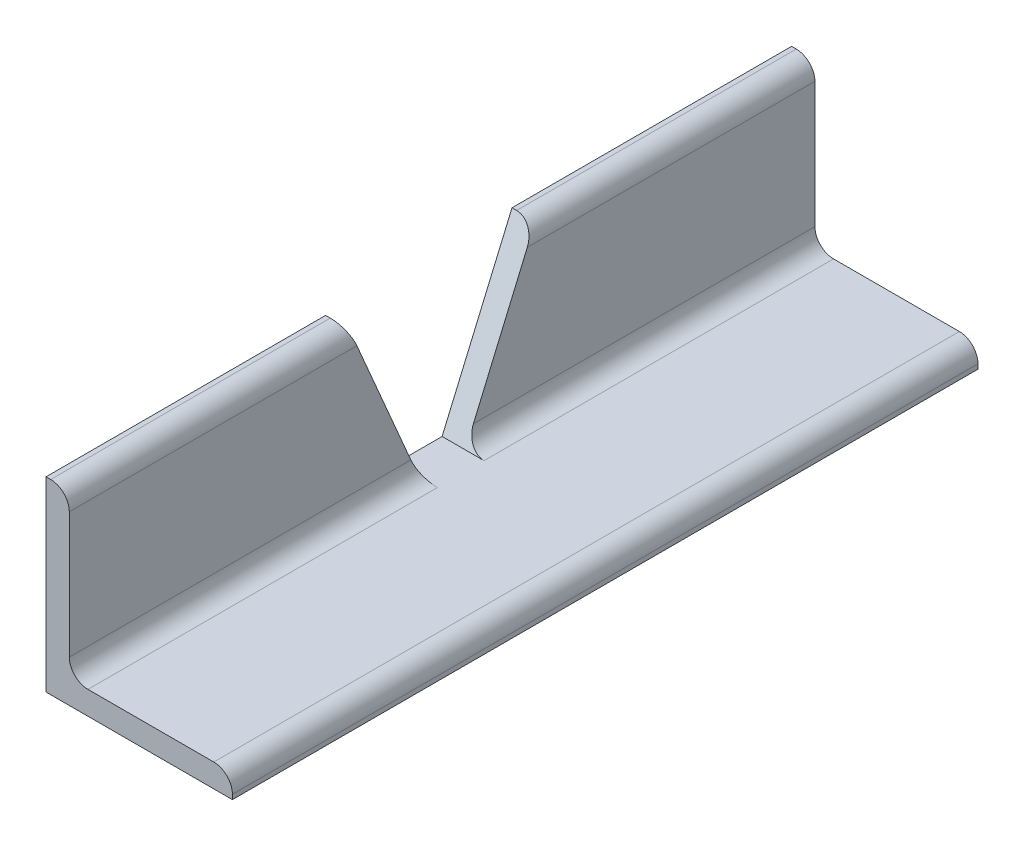
ISO-10303-21;
HEADER;
FILE_DESCRIPTION(('STEP AP214'),'2;1');
FILE_NAME('part.step','',(''),(''),'','','');
FILE_SCHEMA(('AUTOMOTIVE_DESIGN { 1 0 10303 214 1 1 1 1 }'));
ENDSEC;
DATA;
#1=APPLICATION_CONTEXT('core data for automotive mechanical design processes');
#2=APPLICATION_PROTOCOL_DEFINITION('international standard','automotive_design',2000,#1);
#3=PRODUCT_CONTEXT('',#1,'mechanical');
#4=PRODUCT('Part','Part','',(#3));
#5=PRODUCT_RELATED_PRODUCT_CATEGORY('part','',(#4));
#6=PRODUCT_DEFINITION_FORMATION('','',#4);
#7=PRODUCT_DEFINITION_CONTEXT('part definition',#1,'design');
#8=PRODUCT_DEFINITION('design','',#6,#7);
#9=PRODUCT_DEFINITION_SHAPE('','',#8);
#10=(LENGTH_UNIT() NAMED_UNIT(*) SI_UNIT(.MILLI.,.METRE.));
#11=(NAMED_UNIT(*) PLANE_ANGLE_UNIT() SI_UNIT($,.RADIAN.));
#12=(NAMED_UNIT(*) SI_UNIT($,.STERADIAN.) SOLID_ANGLE_UNIT());
#13=UNCERTAINTY_MEASURE_WITH_UNIT(LENGTH_MEASURE(1.E-05),#10,'distance_accuracy_value','');
#14=(GEOMETRIC_REPRESENTATION_CONTEXT(3) GLOBAL_UNCERTAINTY_ASSIGNED_CONTEXT((#13)) GLOBAL_UNIT_ASSIGNED_CONTEXT((#10,
#11,#12)) REPRESENTATION_CONTEXT('',''));
#15=CARTESIAN_POINT('',(0.,0.,0.));
#16=DIRECTION('',(0.,0.,1.));
#17=DIRECTION('',(1.,0.,0.));
#18=AXIS2_PLACEMENT_3D('',#15,#16,#17);
#19=CARTESIAN_POINT('',(-12.065,12.7,50.8));
#20=DIRECTION('',(0.,-1.,0.));
#21=DIRECTION('',(0.,0.,-1.));
#22=AXIS2_PLACEMENT_3D('',#19,#20,#21);
#23=PLANE('',#22);
#24=DIRECTION('',(0.,0.,-1.));
#25=VECTOR('',#24,1.);
#26=CARTESIAN_POINT('',(-12.065,12.7,50.8));
#27=LINE('',#26,#25);
#28=CARTESIAN_POINT('',(-12.065,12.7,50.8));
#29=VERTEX_POINT('',#28);
#30=CARTESIAN_POINT('',(-12.065,12.7,12.7));
#31=VERTEX_POINT('',#30);
#32=EDGE_CURVE('E174',#29,#31,#27,.T.);
#33=ORIENTED_EDGE('',*,*,#32,.T.);
#34=DIRECTION('',(-1.,0.,0.));
#35=VECTOR('',#34,1.);
#36=CARTESIAN_POINT('',(12.7,12.7,12.7));
#37=LINE('',#36,#35);
#38=CARTESIAN_POINT('',(-12.7,12.7,12.7));
#39=VERTEX_POINT('',#38);
#40=EDGE_CURVE('E231',#31,#39,#37,.T.);
#41=ORIENTED_EDGE('',*,*,#40,.T.);
#42=DIRECTION('',(0.,0.,-1.));
#43=VECTOR('',#42,1.);
#44=CARTESIAN_POINT('',(-12.7,12.7,50.8));
#45=LINE('',#44,#43);
#46=CARTESIAN_POINT('',(-12.7,12.7,50.8));
#47=VERTEX_POINT('',#46);
#48=EDGE_CURVE('E193',#47,#39,#45,.T.);
#49=ORIENTED_EDGE('',*,*,#48,.F.);
#50=DIRECTION('',(-1.,0.,0.));
#51=VECTOR('',#50,1.);
#52=CARTESIAN_POINT('',(-12.065,12.7,50.8));
#53=LINE('',#52,#51);
#54=EDGE_CURVE('E173',#29,#47,#53,.T.);
#55=ORIENTED_EDGE('',*,*,#54,.F.);
#56=EDGE_LOOP('',(#33,#41,#49,#55));
#57=FACE_BOUND('',#56,.T.);
#58=ADVANCED_FACE('F33',(#57),#23,.F.);
#59=CARTESIAN_POINT('',(-6.985,-6.985,50.8));
#60=DIRECTION('',(0.,0.,-1.));
#61=DIRECTION('',(-1.,0.,0.));
#62=AXIS2_PLACEMENT_3D('',#59,#60,#61);
#63=CYLINDRICAL_SURFACE('',#62,2.54);
#64=DIRECTION('',(0.,0.,-1.));
#65=VECTOR('',#64,1.);
#66=CARTESIAN_POINT('',(-6.985,-9.525,50.8));
#67=LINE('',#66,#65);
#68=CARTESIAN_POINT('',(-6.985,-9.525,50.8));
#69=VERTEX_POINT('',#68);
#70=CARTESIAN_POINT('',(-6.985,-9.525,3.175));
#71=VERTEX_POINT('',#70);
#72=EDGE_CURVE('E179',#69,#71,#67,.T.);
#73=ORIENTED_EDGE('',*,*,#72,.T.);
#74=CARTESIAN_POINT('',(-6.985,-6.985,4.26357142857144));
#75=DIRECTION('',(0.,-0.393919298579168,0.919145030018058));
#76=DIRECTION('',(0.,-0.919145030018058,-0.393919298579168));
#77=AXIS2_PLACEMENT_3D('',#74,#75,#76);
#78=ELLIPSE('',#77,2.76343766984205,2.54);
#79=CARTESIAN_POINT('',(-9.525,-6.985,4.26357142857143));
#80=VERTEX_POINT('',#79);
#81=EDGE_CURVE('E138',#71,#80,#78,.F.);
#82=ORIENTED_EDGE('',*,*,#81,.T.);
#83=DIRECTION('',(0.,0.,-1.));
#84=VECTOR('',#83,1.);
#85=CARTESIAN_POINT('',(-9.525,-6.985,50.8));
#86=LINE('',#85,#84);
#87=CARTESIAN_POINT('',(-9.525,-6.985,50.8));
#88=VERTEX_POINT('',#87);
#89=EDGE_CURVE('E135',#88,#80,#86,.T.);
#90=ORIENTED_EDGE('',*,*,#89,.F.);
#91=CARTESIAN_POINT('',(-6.985,-6.985,50.8));
#92=DIRECTION('',(0.,0.,-1.));
#93=DIRECTION('',(1.,0.,0.));
#94=AXIS2_PLACEMENT_3D('',#91,#92,#93);
#95=CIRCLE('',#94,2.54);
#96=EDGE_CURVE('E121',#69,#88,#95,.T.);
#97=ORIENTED_EDGE('',*,*,#96,.F.);
#98=EDGE_LOOP('',(#73,#82,#90,#97));
#99=FACE_BOUND('',#98,.T.);
#100=ADVANCED_FACE('F136',(#99),#63,.F.);
#101=CARTESIAN_POINT('',(-9.525,10.16,50.8));
#102=DIRECTION('',(-1.,0.,0.));
#103=DIRECTION('',(0.,-1.,0.));
#104=AXIS2_PLACEMENT_3D('',#101,#102,#103);
#105=PLANE('',#104);
#106=ORIENTED_EDGE('',*,*,#89,.T.);
#107=DIRECTION('',(0.,0.919145030018058,0.393919298579168));
#108=VECTOR('',#107,1.);
#109=CARTESIAN_POINT('',(-9.525,24.3489655172414,17.6924137931034));
#110=LINE('',#109,#108);
#111=CARTESIAN_POINT('',(-9.525,10.16,11.6114285714286));
#112=VERTEX_POINT('',#111);
#113=EDGE_CURVE('E245',#80,#112,#110,.T.);
#114=ORIENTED_EDGE('',*,*,#113,.T.);
#115=DIRECTION('',(0.,0.,-1.));
#116=VECTOR('',#115,1.);
#117=CARTESIAN_POINT('',(-9.525,10.16,50.8));
#118=LINE('',#117,#116);
#119=CARTESIAN_POINT('',(-9.525,10.16,50.8));
#120=VERTEX_POINT('',#119);
#121=EDGE_CURVE('E146',#120,#112,#118,.T.);
#122=ORIENTED_EDGE('',*,*,#121,.F.);
#123=DIRECTION('',(0.,1.,0.));
#124=VECTOR('',#123,1.);
#125=CARTESIAN_POINT('',(-9.525,10.16,50.8));
#126=LINE('',#125,#124);
#127=EDGE_CURVE('E125',#88,#120,#126,.T.);
#128=ORIENTED_EDGE('',*,*,#127,.F.);
#129=EDGE_LOOP('',(#106,#114,#122,#128));
#130=FACE_BOUND('',#129,.T.);
#131=ADVANCED_FACE('F144',(#130),#105,.F.);
#132=CARTESIAN_POINT('',(-12.065,10.16,50.8));
#133=DIRECTION('',(0.,0.,-1.));
#134=DIRECTION('',(-1.,0.,0.));
#135=AXIS2_PLACEMENT_3D('',#132,#133,#134);
#136=CYLINDRICAL_SURFACE('',#135,2.54);
#137=ORIENTED_EDGE('',*,*,#121,.T.);
#138=CARTESIAN_POINT('',(-12.065,10.16,11.6114285714286));
#139=DIRECTION('',(0.,-0.393919298579168,0.919145030018058));
#140=DIRECTION('',(0.,-0.919145030018058,-0.393919298579168));
#141=AXIS2_PLACEMENT_3D('',#138,#139,#140);
#142=ELLIPSE('',#141,2.76343766984205,2.54);
#143=EDGE_CURVE('E11',#112,#31,#142,.T.);
#144=ORIENTED_EDGE('',*,*,#143,.T.);
#145=ORIENTED_EDGE('',*,*,#32,.F.);
#146=CARTESIAN_POINT('',(-12.065,10.16,50.8));
#147=DIRECTION('',(0.,0.,1.));
#148=DIRECTION('',(1.,0.,0.));
#149=AXIS2_PLACEMENT_3D('',#146,#147,#148);
#150=CIRCLE('',#149,2.54);
#151=EDGE_CURVE('E57',#120,#29,#150,.T.);
#152=ORIENTED_EDGE('',*,*,#151,.F.);
#153=EDGE_LOOP('',(#137,#144,#145,#152));
#154=FACE_BOUND('',#153,.T.);
#155=ADVANCED_FACE('F281',(#154),#136,.T.);
#156=CARTESIAN_POINT('',(-12.7,12.7,-12.7));
#157=VERTEX_POINT('',#156);
#158=CARTESIAN_POINT('',(-12.7,12.7,-50.8));
#159=VERTEX_POINT('',#158);
#160=EDGE_CURVE('E192',#157,#159,#45,.T.);
#161=ORIENTED_EDGE('',*,*,#160,.F.);
#162=DIRECTION('',(-1.,0.,0.));
#163=VECTOR('',#162,1.);
#164=CARTESIAN_POINT('',(12.7,12.7,-12.7));
#165=LINE('',#164,#163);
#166=CARTESIAN_POINT('',(-12.065,12.7,-12.7));
#167=VERTEX_POINT('',#166);
#168=EDGE_CURVE('E213',#167,#157,#165,.T.);
#169=ORIENTED_EDGE('',*,*,#168,.F.);
#170=CARTESIAN_POINT('',(-12.065,12.7,-50.8));
#171=VERTEX_POINT('',#170);
#172=EDGE_CURVE('E94',#167,#171,#27,.T.);
#173=ORIENTED_EDGE('',*,*,#172,.T.);
#174=DIRECTION('',(-1.,0.,0.));
#175=VECTOR('',#174,1.);
#176=CARTESIAN_POINT('',(-12.065,12.7,-50.8));
#177=LINE('',#176,#175);
#178=EDGE_CURVE('E151',#171,#159,#177,.T.);
#179=ORIENTED_EDGE('',*,*,#178,.T.);
#180=EDGE_LOOP('',(#161,#169,#173,#179));
#181=FACE_BOUND('',#180,.T.);
#182=ADVANCED_FACE('F35',(#181),#23,.F.);
#183=CARTESIAN_POINT('',(-12.7,12.7,50.8));
#184=DIRECTION('',(1.,0.,0.));
#185=DIRECTION('',(0.,1.,0.));
#186=AXIS2_PLACEMENT_3D('',#183,#184,#185);
#187=PLANE('',#186);
#188=ORIENTED_EDGE('',*,*,#48,.T.);
#189=DIRECTION('',(0.,0.919145030018058,0.393919298579168));
#190=VECTOR('',#189,1.);
#191=CARTESIAN_POINT('',(-12.7,12.7,12.7));
#192=LINE('',#191,#190);
#193=CARTESIAN_POINT('',(-12.7,-9.525,3.175));
#194=VERTEX_POINT('',#193);
#195=EDGE_CURVE('E226',#194,#39,#192,.T.);
#196=ORIENTED_EDGE('',*,*,#195,.F.);
#197=DIRECTION('',(0.,0.,1.));
#198=VECTOR('',#197,1.);
#199=CARTESIAN_POINT('',(-12.7,-9.525,-3.175));
#200=LINE('',#199,#198);
#201=CARTESIAN_POINT('',(-12.7,-9.525,-3.175));
#202=VERTEX_POINT('',#201);
#203=EDGE_CURVE('E223',#202,#194,#200,.T.);
#204=ORIENTED_EDGE('',*,*,#203,.F.);
#205=DIRECTION('',(0.,-0.919145030018058,0.393919298579167));
#206=VECTOR('',#205,1.);
#207=CARTESIAN_POINT('',(-12.7,12.7,-12.7));
#208=LINE('',#207,#206);
#209=EDGE_CURVE('E220',#157,#202,#208,.T.);
#210=ORIENTED_EDGE('',*,*,#209,.F.);
#211=ORIENTED_EDGE('',*,*,#160,.T.);
#212=DIRECTION('',(0.,-1.,0.));
#213=VECTOR('',#212,1.);
#214=CARTESIAN_POINT('',(-12.7,12.7,-50.8));
#215=LINE('',#214,#213);
#216=CARTESIAN_POINT('',(-12.7,-12.7,-50.8));
#217=VERTEX_POINT('',#216);
#218=EDGE_CURVE('E153',#159,#217,#215,.T.);
#219=ORIENTED_EDGE('',*,*,#218,.T.);
#220=DIRECTION('',(0.,0.,-1.));
#221=VECTOR('',#220,1.);
#222=CARTESIAN_POINT('',(-12.7,-12.7,50.8));
#223=LINE('',#222,#221);
#224=CARTESIAN_POINT('',(-12.7,-12.7,50.8));
#225=VERTEX_POINT('',#224);
#226=EDGE_CURVE('E189',#225,#217,#223,.T.);
#227=ORIENTED_EDGE('',*,*,#226,.F.);
#228=DIRECTION('',(0.,-1.,0.));
#229=VECTOR('',#228,1.);
#230=CARTESIAN_POINT('',(-12.7,12.7,50.8));
#231=LINE('',#230,#229);
#232=EDGE_CURVE('E103',#47,#225,#231,.T.);
#233=ORIENTED_EDGE('',*,*,#232,.F.);
#234=EDGE_LOOP('',(#188,#196,#204,#210,#211,#219,#227,#233));
#235=FACE_BOUND('',#234,.T.);
#236=ADVANCED_FACE('F217',(#235),#187,.F.);
#237=CARTESIAN_POINT('',(-12.7,-12.7,50.8));
#238=DIRECTION('',(0.,1.,0.));
#239=DIRECTION('',(0.,0.,1.));
#240=AXIS2_PLACEMENT_3D('',#237,#238,#239);
#241=PLANE('',#240);
#242=DIRECTION('',(1.,0.,0.));
#243=VECTOR('',#242,1.);
#244=CARTESIAN_POINT('',(-12.7,-12.7,-50.8));
#245=LINE('',#244,#243);
#246=CARTESIAN_POINT('',(12.7,-12.7,-50.8));
#247=VERTEX_POINT('',#246);
#248=EDGE_CURVE('E155',#217,#247,#245,.T.);
#249=ORIENTED_EDGE('',*,*,#248,.T.);
#250=DIRECTION('',(0.,0.,-1.));
#251=VECTOR('',#250,1.);
#252=CARTESIAN_POINT('',(12.7,-12.7,50.8));
#253=LINE('',#252,#251);
#254=CARTESIAN_POINT('',(12.7,-12.7,50.8));
#255=VERTEX_POINT('',#254);
#256=EDGE_CURVE('E186',#255,#247,#253,.T.);
#257=ORIENTED_EDGE('',*,*,#256,.F.);
#258=DIRECTION('',(1.,0.,0.));
#259=VECTOR('',#258,1.);
#260=CARTESIAN_POINT('',(-12.7,-12.7,50.8));
#261=LINE('',#260,#259);
#262=EDGE_CURVE('E250',#225,#255,#261,.T.);
#263=ORIENTED_EDGE('',*,*,#262,.F.);
#264=ORIENTED_EDGE('',*,*,#226,.T.);
#265=EDGE_LOOP('',(#249,#257,#263,#264));
#266=FACE_BOUND('',#265,.T.);
#267=ADVANCED_FACE('F288',(#266),#241,.F.);
#268=CARTESIAN_POINT('',(12.7,-12.7,50.8));
#269=DIRECTION('',(-1.,0.,0.));
#270=DIRECTION('',(0.,-1.,0.));
#271=AXIS2_PLACEMENT_3D('',#268,#269,#270);
#272=PLANE('',#271);
#273=DIRECTION('',(0.,1.,0.));
#274=VECTOR('',#273,1.);
#275=CARTESIAN_POINT('',(12.7,-12.7,-50.8));
#276=LINE('',#275,#274);
#277=CARTESIAN_POINT('',(12.7,-12.065,-50.8));
#278=VERTEX_POINT('',#277);
#279=EDGE_CURVE('E157',#247,#278,#276,.T.);
#280=ORIENTED_EDGE('',*,*,#279,.T.);
#281=DIRECTION('',(0.,0.,-1.));
#282=VECTOR('',#281,1.);
#283=CARTESIAN_POINT('',(12.7,-12.065,50.8));
#284=LINE('',#283,#282);
#285=CARTESIAN_POINT('',(12.7,-12.065,50.8));
#286=VERTEX_POINT('',#285);
#287=EDGE_CURVE('E183',#286,#278,#284,.T.);
#288=ORIENTED_EDGE('',*,*,#287,.F.);
#289=DIRECTION('',(0.,1.,0.));
#290=VECTOR('',#289,1.);
#291=CARTESIAN_POINT('',(12.7,-12.7,50.8));
#292=LINE('',#291,#290);
#293=EDGE_CURVE('E252',#255,#286,#292,.T.);
#294=ORIENTED_EDGE('',*,*,#293,.F.);
#295=ORIENTED_EDGE('',*,*,#256,.T.);
#296=EDGE_LOOP('',(#280,#288,#294,#295));
#297=FACE_BOUND('',#296,.T.);
#298=ADVANCED_FACE('F291',(#297),#272,.F.);
#299=CARTESIAN_POINT('',(10.16,-12.065,50.8));
#300=DIRECTION('',(0.,0.,-1.));
#301=DIRECTION('',(-1.,0.,0.));
#302=AXIS2_PLACEMENT_3D('',#299,#300,#301);
#303=CYLINDRICAL_SURFACE('',#302,2.54);
#304=CARTESIAN_POINT('',(10.16,-12.065,-50.8));
#305=DIRECTION('',(0.,0.,1.));
#306=DIRECTION('',(-1.,0.,0.));
#307=AXIS2_PLACEMENT_3D('',#304,#305,#306);
#308=CIRCLE('',#307,2.54);
#309=CARTESIAN_POINT('',(10.16,-9.525,-50.8));
#310=VERTEX_POINT('',#309);
#311=EDGE_CURVE('E159',#278,#310,#308,.T.);
#312=ORIENTED_EDGE('',*,*,#311,.T.);
#313=DIRECTION('',(0.,0.,-1.));
#314=VECTOR('',#313,1.);
#315=CARTESIAN_POINT('',(10.16,-9.525,50.8));
#316=LINE('',#315,#314);
#317=CARTESIAN_POINT('',(10.16,-9.525,50.8));
#318=VERTEX_POINT('',#317);
#319=EDGE_CURVE('E181',#318,#310,#316,.T.);
#320=ORIENTED_EDGE('',*,*,#319,.F.);
#321=CARTESIAN_POINT('',(10.16,-12.065,50.8));
#322=DIRECTION('',(0.,0.,1.));
#323=DIRECTION('',(-1.,0.,0.));
#324=AXIS2_PLACEMENT_3D('',#321,#322,#323);
#325=CIRCLE('',#324,2.54);
#326=EDGE_CURVE('E254',#286,#318,#325,.T.);
#327=ORIENTED_EDGE('',*,*,#326,.F.);
#328=ORIENTED_EDGE('',*,*,#287,.T.);
#329=EDGE_LOOP('',(#312,#320,#327,#328));
#330=FACE_BOUND('',#329,.T.);
#331=ADVANCED_FACE('F260',(#330),#303,.T.);
#332=CARTESIAN_POINT('',(-6.985,-9.525,50.8));
#333=DIRECTION('',(0.,-1.,0.));
#334=DIRECTION('',(0.,0.,-1.));
#335=AXIS2_PLACEMENT_3D('',#332,#333,#334);
#336=PLANE('',#335);
#337=CARTESIAN_POINT('',(-6.985,-9.525,-3.17500000000001));
#338=VERTEX_POINT('',#337);
#339=CARTESIAN_POINT('',(-6.985,-9.525,-50.8));
#340=VERTEX_POINT('',#339);
#341=EDGE_CURVE('E141',#338,#340,#67,.T.);
#342=ORIENTED_EDGE('',*,*,#341,.F.);
#343=DIRECTION('',(-1.,0.,0.));
#344=VECTOR('',#343,1.);
#345=CARTESIAN_POINT('',(12.7,-9.525,-3.175));
#346=LINE('',#345,#344);
#347=EDGE_CURVE('E237',#338,#202,#346,.T.);
#348=ORIENTED_EDGE('',*,*,#347,.T.);
#349=ORIENTED_EDGE('',*,*,#203,.T.);
#350=DIRECTION('',(-1.,0.,0.));
#351=VECTOR('',#350,1.);
#352=CARTESIAN_POINT('',(12.7,-9.525,3.175));
#353=LINE('',#352,#351);
#354=EDGE_CURVE('E234',#71,#194,#353,.T.);
#355=ORIENTED_EDGE('',*,*,#354,.F.);
#356=ORIENTED_EDGE('',*,*,#72,.F.);
#357=DIRECTION('',(-1.,0.,0.));
#358=VECTOR('',#357,1.);
#359=CARTESIAN_POINT('',(-6.985,-9.525,50.8));
#360=LINE('',#359,#358);
#361=EDGE_CURVE('E128',#318,#69,#360,.T.);
#362=ORIENTED_EDGE('',*,*,#361,.F.);
#363=ORIENTED_EDGE('',*,*,#319,.T.);
#364=DIRECTION('',(-1.,0.,0.));
#365=VECTOR('',#364,1.);
#366=CARTESIAN_POINT('',(-6.985,-9.525,-50.8));
#367=LINE('',#366,#365);
#368=EDGE_CURVE('E162',#310,#340,#367,.T.);
#369=ORIENTED_EDGE('',*,*,#368,.T.);
#370=EDGE_LOOP('',(#342,#348,#349,#355,#356,#362,#363,#369));
#371=FACE_BOUND('',#370,.T.);
#372=ADVANCED_FACE('F265',(#371),#336,.F.);
#373=CARTESIAN_POINT('',(-9.525,-6.985,-4.26357142857143));
#374=VERTEX_POINT('',#373);
#375=CARTESIAN_POINT('',(-9.525,-6.985,-50.8));
#376=VERTEX_POINT('',#375);
#377=EDGE_CURVE('E142',#374,#376,#86,.T.);
#378=ORIENTED_EDGE('',*,*,#377,.F.);
#379=CARTESIAN_POINT('',(-6.985,-6.985,-4.26357142857144));
#380=DIRECTION('',(0.,-0.393919298579167,-0.919145030018058));
#381=DIRECTION('',(0.,0.919145030018058,-0.393919298579168));
#382=AXIS2_PLACEMENT_3D('',#379,#380,#381);
#383=ELLIPSE('',#382,2.76343766984205,2.54);
#384=EDGE_CURVE('E242',#374,#338,#383,.F.);
#385=ORIENTED_EDGE('',*,*,#384,.T.);
#386=ORIENTED_EDGE('',*,*,#341,.T.);
#387=CARTESIAN_POINT('',(-6.985,-6.985,-50.8));
#388=DIRECTION('',(0.,0.,-1.));
#389=DIRECTION('',(1.,0.,0.));
#390=AXIS2_PLACEMENT_3D('',#387,#388,#389);
#391=CIRCLE('',#390,2.54);
#392=EDGE_CURVE('E165',#340,#376,#391,.T.);
#393=ORIENTED_EDGE('',*,*,#392,.T.);
#394=EDGE_LOOP('',(#378,#385,#386,#393));
#395=FACE_BOUND('',#394,.T.);
#396=ADVANCED_FACE('F293',(#395),#63,.F.);
#397=CARTESIAN_POINT('',(-9.525,10.16,-11.6114285714286));
#398=VERTEX_POINT('',#397);
#399=CARTESIAN_POINT('',(-9.525,10.16,-50.8));
#400=VERTEX_POINT('',#399);
#401=EDGE_CURVE('E177',#398,#400,#118,.T.);
#402=ORIENTED_EDGE('',*,*,#401,.F.);
#403=DIRECTION('',(0.,-0.919145030018058,0.393919298579168));
#404=VECTOR('',#403,1.);
#405=CARTESIAN_POINT('',(-9.525,-12.4372413793103,-1.92689655172414));
#406=LINE('',#405,#404);
#407=EDGE_CURVE('E48',#398,#374,#406,.T.);
#408=ORIENTED_EDGE('',*,*,#407,.T.);
#409=ORIENTED_EDGE('',*,*,#377,.T.);
#410=DIRECTION('',(0.,1.,0.));
#411=VECTOR('',#410,1.);
#412=CARTESIAN_POINT('',(-9.525,10.16,-50.8));
#413=LINE('',#412,#411);
#414=EDGE_CURVE('E168',#376,#400,#413,.T.);
#415=ORIENTED_EDGE('',*,*,#414,.T.);
#416=EDGE_LOOP('',(#402,#408,#409,#415));
#417=FACE_BOUND('',#416,.T.);
#418=ADVANCED_FACE('F200',(#417),#105,.F.);
#419=ORIENTED_EDGE('',*,*,#172,.F.);
#420=CARTESIAN_POINT('',(-12.065,10.16,-11.6114285714286));
#421=DIRECTION('',(0.,-0.393919298579167,-0.919145030018058));
#422=DIRECTION('',(0.,0.919145030018058,-0.393919298579168));
#423=AXIS2_PLACEMENT_3D('',#420,#421,#422);
#424=ELLIPSE('',#423,2.76343766984205,2.54);
#425=EDGE_CURVE('E41',#167,#398,#424,.T.);
#426=ORIENTED_EDGE('',*,*,#425,.T.);
#427=ORIENTED_EDGE('',*,*,#401,.T.);
#428=CARTESIAN_POINT('',(-12.065,10.16,-50.8));
#429=DIRECTION('',(0.,0.,1.));
#430=DIRECTION('',(1.,0.,0.));
#431=AXIS2_PLACEMENT_3D('',#428,#429,#430);
#432=CIRCLE('',#431,2.54);
#433=EDGE_CURVE('E171',#400,#171,#432,.T.);
#434=ORIENTED_EDGE('',*,*,#433,.T.);
#435=EDGE_LOOP('',(#419,#426,#427,#434));
#436=FACE_BOUND('',#435,.T.);
#437=ADVANCED_FACE('F196',(#436),#136,.T.);
#438=CARTESIAN_POINT('',(10.16,-12.065,50.8));
#439=DIRECTION('',(0.,0.,-1.));
#440=DIRECTION('',(-1.,0.,0.));
#441=AXIS2_PLACEMENT_3D('',#438,#439,#440);
#442=PLANE('',#441);
#443=ORIENTED_EDGE('',*,*,#54,.T.);
#444=ORIENTED_EDGE('',*,*,#232,.T.);
#445=ORIENTED_EDGE('',*,*,#262,.T.);
#446=ORIENTED_EDGE('',*,*,#293,.T.);
#447=ORIENTED_EDGE('',*,*,#326,.T.);
#448=ORIENTED_EDGE('',*,*,#361,.T.);
#449=ORIENTED_EDGE('',*,*,#96,.T.);
#450=ORIENTED_EDGE('',*,*,#127,.T.);
#451=ORIENTED_EDGE('',*,*,#151,.T.);
#452=EDGE_LOOP('',(#443,#444,#445,#446,#447,#448,#449,#450,#451));
#453=FACE_BOUND('',#452,.T.);
#454=ADVANCED_FACE('F123',(#453),#442,.F.);
#455=CARTESIAN_POINT('',(10.16,-12.065,-50.8));
#456=DIRECTION('',(0.,0.,-1.));
#457=DIRECTION('',(-1.,0.,0.));
#458=AXIS2_PLACEMENT_3D('',#455,#456,#457);
#459=PLANE('',#458);
#460=ORIENTED_EDGE('',*,*,#178,.F.);
#461=ORIENTED_EDGE('',*,*,#433,.F.);
#462=ORIENTED_EDGE('',*,*,#414,.F.);
#463=ORIENTED_EDGE('',*,*,#392,.F.);
#464=ORIENTED_EDGE('',*,*,#368,.F.);
#465=ORIENTED_EDGE('',*,*,#311,.F.);
#466=ORIENTED_EDGE('',*,*,#279,.F.);
#467=ORIENTED_EDGE('',*,*,#248,.F.);
#468=ORIENTED_EDGE('',*,*,#218,.F.);
#469=EDGE_LOOP('',(#460,#461,#462,#463,#464,#465,#466,#467,#468));
#470=FACE_BOUND('',#469,.T.);
#471=ADVANCED_FACE('F208',(#470),#459,.T.);
#472=CARTESIAN_POINT('',(12.7,12.7,12.7));
#473=DIRECTION('',(0.,-0.393919298579168,0.919145030018058));
#474=DIRECTION('',(0.,-0.919145030018058,-0.393919298579168));
#475=AXIS2_PLACEMENT_3D('',#472,#473,#474);
#476=PLANE('',#475);
#477=ORIENTED_EDGE('',*,*,#354,.T.);
#478=ORIENTED_EDGE('',*,*,#195,.T.);
#479=ORIENTED_EDGE('',*,*,#40,.F.);
#480=ORIENTED_EDGE('',*,*,#143,.F.);
#481=ORIENTED_EDGE('',*,*,#113,.F.);
#482=ORIENTED_EDGE('',*,*,#81,.F.);
#483=EDGE_LOOP('',(#477,#478,#479,#480,#481,#482));
#484=FACE_BOUND('',#483,.T.);
#485=ADVANCED_FACE('F279',(#484),#476,.F.);
#486=CARTESIAN_POINT('',(12.7,12.7,-12.7));
#487=DIRECTION('',(0.,-0.393919298579167,-0.919145030018058));
#488=DIRECTION('',(0.,0.919145030018058,-0.393919298579168));
#489=AXIS2_PLACEMENT_3D('',#486,#487,#488);
#490=PLANE('',#489);
#491=ORIENTED_EDGE('',*,*,#407,.F.);
#492=ORIENTED_EDGE('',*,*,#425,.F.);
#493=ORIENTED_EDGE('',*,*,#168,.T.);
#494=ORIENTED_EDGE('',*,*,#209,.T.);
#495=ORIENTED_EDGE('',*,*,#347,.F.);
#496=ORIENTED_EDGE('',*,*,#384,.F.);
#497=EDGE_LOOP('',(#491,#492,#493,#494,#495,#496));
#498=FACE_BOUND('',#497,.T.);
#499=ADVANCED_FACE('F294',(#498),#490,.F.);
#500=CLOSED_SHELL('',(#58,#100,#131,#155,#182,#236,#267,#298,#331,#372,#396,#418,#437,#454,#471,
#485,#499));
#501=MANIFOLD_SOLID_BREP('B2',#500);
#502=ADVANCED_BREP_SHAPE_REPRESENTATION('',(#18,#501),#14);
#503=SHAPE_DEFINITION_REPRESENTATION(#9,#502);
ENDSEC;
END-ISO-10303-21;
